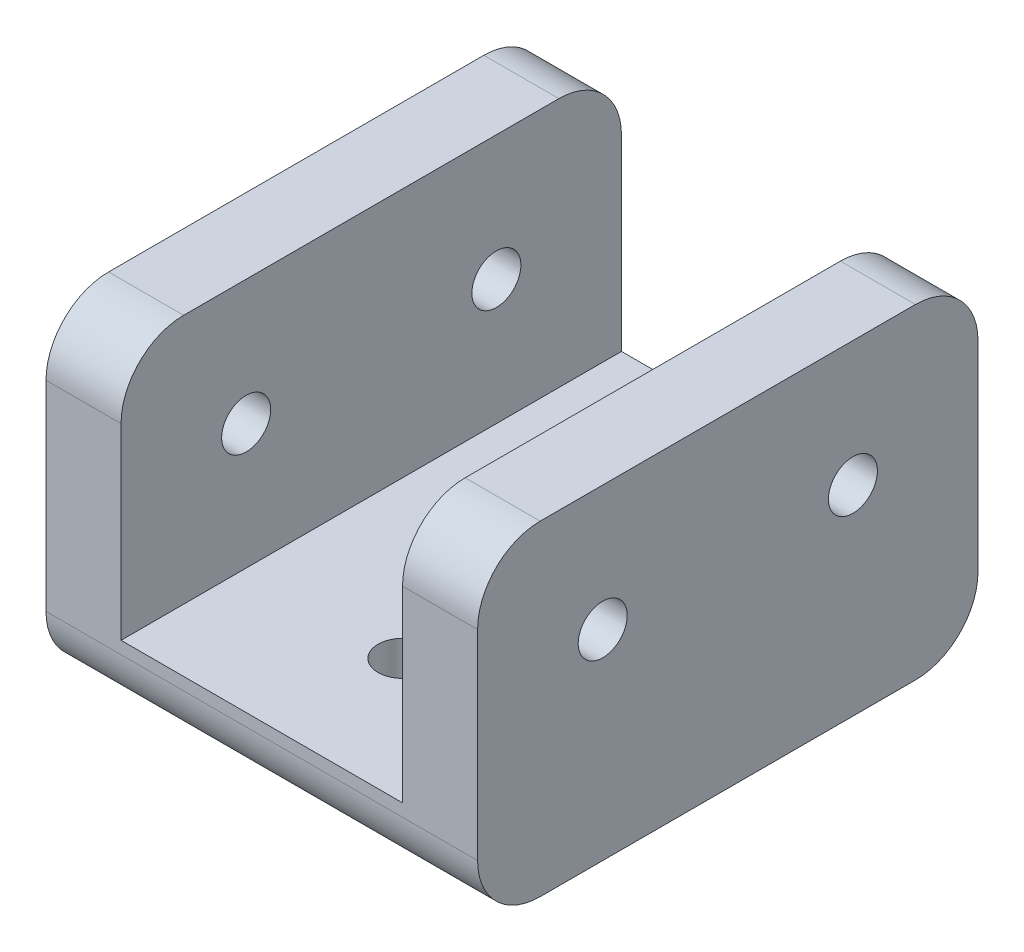
ISO-10303-21;
HEADER;
FILE_DESCRIPTION(('STEP AP214'),'2;1');
FILE_NAME('part.step','',(''),(''),'','','');
FILE_SCHEMA(('AUTOMOTIVE_DESIGN { 1 0 10303 214 1 1 1 1 }'));
ENDSEC;
DATA;
#1=APPLICATION_CONTEXT('core data for automotive mechanical design processes');
#2=APPLICATION_PROTOCOL_DEFINITION('international standard','automotive_design',2000,#1);
#3=PRODUCT_CONTEXT('',#1,'mechanical');
#4=PRODUCT('Part','Part','',(#3));
#5=PRODUCT_RELATED_PRODUCT_CATEGORY('part','',(#4));
#6=PRODUCT_DEFINITION_FORMATION('','',#4);
#7=PRODUCT_DEFINITION_CONTEXT('part definition',#1,'design');
#8=PRODUCT_DEFINITION('design','',#6,#7);
#9=PRODUCT_DEFINITION_SHAPE('','',#8);
#10=(LENGTH_UNIT() NAMED_UNIT(*) SI_UNIT(.MILLI.,.METRE.));
#11=(NAMED_UNIT(*) PLANE_ANGLE_UNIT() SI_UNIT($,.RADIAN.));
#12=(NAMED_UNIT(*) SI_UNIT($,.STERADIAN.) SOLID_ANGLE_UNIT());
#13=UNCERTAINTY_MEASURE_WITH_UNIT(LENGTH_MEASURE(1.E-05),#10,'distance_accuracy_value','');
#14=(GEOMETRIC_REPRESENTATION_CONTEXT(3) GLOBAL_UNCERTAINTY_ASSIGNED_CONTEXT((#13)) GLOBAL_UNIT_ASSIGNED_CONTEXT((#10,
#11,#12)) REPRESENTATION_CONTEXT('',''));
#15=CARTESIAN_POINT('',(0.,0.,0.));
#16=DIRECTION('',(0.,0.,1.));
#17=DIRECTION('',(1.,0.,0.));
#18=AXIS2_PLACEMENT_3D('',#15,#16,#17);
#19=CARTESIAN_POINT('',(0.,33.02,-50.8));
#20=DIRECTION('',(0.,-1.,0.));
#21=DIRECTION('',(0.,0.,-1.));
#22=AXIS2_PLACEMENT_3D('',#19,#20,#21);
#23=PLANE('',#22);
#24=DIRECTION('',(0.,0.,1.));
#25=VECTOR('',#24,1.);
#26=CARTESIAN_POINT('',(43.815,33.02,-50.8));
#27=LINE('',#26,#25);
#28=CARTESIAN_POINT('',(43.815,33.02,-44.45));
#29=VERTEX_POINT('',#28);
#30=CARTESIAN_POINT('',(43.815,33.02,-6.35));
#31=VERTEX_POINT('',#30);
#32=EDGE_CURVE('E183',#29,#31,#27,.T.);
#33=ORIENTED_EDGE('',*,*,#32,.F.);
#34=DIRECTION('',(1.,0.,0.));
#35=VECTOR('',#34,1.);
#36=CARTESIAN_POINT('',(0.,33.02,-44.45));
#37=LINE('',#36,#35);
#38=CARTESIAN_POINT('',(36.195,33.02,-44.45));
#39=VERTEX_POINT('',#38);
#40=EDGE_CURVE('E198',#29,#39,#37,.F.);
#41=ORIENTED_EDGE('',*,*,#40,.T.);
#42=DIRECTION('',(0.,0.,1.));
#43=VECTOR('',#42,1.);
#44=CARTESIAN_POINT('',(36.195,33.02,-50.8));
#45=LINE('',#44,#43);
#46=CARTESIAN_POINT('',(36.195,33.02,-6.35));
#47=VERTEX_POINT('',#46);
#48=EDGE_CURVE('E171',#39,#47,#45,.T.);
#49=ORIENTED_EDGE('',*,*,#48,.T.);
#50=DIRECTION('',(1.,0.,0.));
#51=VECTOR('',#50,1.);
#52=CARTESIAN_POINT('',(43.815,33.02,-6.35));
#53=LINE('',#52,#51);
#54=EDGE_CURVE('E195',#47,#31,#53,.T.);
#55=ORIENTED_EDGE('',*,*,#54,.T.);
#56=EDGE_LOOP('',(#33,#41,#49,#55));
#57=FACE_BOUND('',#56,.T.);
#58=ADVANCED_FACE('F41',(#57),#23,.F.);
#59=CARTESIAN_POINT('',(43.815,0.,-50.8));
#60=DIRECTION('',(1.,0.,0.));
#61=DIRECTION('',(0.,0.,-1.));
#62=AXIS2_PLACEMENT_3D('',#59,#60,#61);
#63=PLANE('',#62);
#64=CARTESIAN_POINT('',(43.815,20.32,-38.1));
#65=DIRECTION('',(-1.,0.,0.));
#66=DIRECTION('',(0.,0.,1.));
#67=AXIS2_PLACEMENT_3D('',#64,#65,#66);
#68=CIRCLE('',#67,2.4892);
#69=CARTESIAN_POINT('',(43.815,20.32,-35.6108));
#70=VERTEX_POINT('',#69);
#71=EDGE_CURVE('E232',#70,#70,#68,.T.);
#72=ORIENTED_EDGE('',*,*,#71,.T.);
#73=EDGE_LOOP('',(#72));
#74=FACE_BOUND('',#73,.T.);
#75=CARTESIAN_POINT('',(43.815,20.32,-12.7));
#76=DIRECTION('',(-1.,0.,0.));
#77=DIRECTION('',(0.,0.,1.));
#78=AXIS2_PLACEMENT_3D('',#75,#76,#77);
#79=CIRCLE('',#78,2.4892);
#80=CARTESIAN_POINT('',(43.815,20.32,-10.2108));
#81=VERTEX_POINT('',#80);
#82=EDGE_CURVE('E242',#81,#81,#79,.T.);
#83=ORIENTED_EDGE('',*,*,#82,.T.);
#84=EDGE_LOOP('',(#83));
#85=FACE_BOUND('',#84,.T.);
#86=DIRECTION('',(0.,1.,0.));
#87=VECTOR('',#86,1.);
#88=CARTESIAN_POINT('',(43.815,0.,-50.8));
#89=LINE('',#88,#87);
#90=CARTESIAN_POINT('',(43.815,6.35,-50.8));
#91=VERTEX_POINT('',#90);
#92=CARTESIAN_POINT('',(43.815,26.67,-50.8));
#93=VERTEX_POINT('',#92);
#94=EDGE_CURVE('E176',#91,#93,#89,.T.);
#95=ORIENTED_EDGE('',*,*,#94,.T.);
#96=CARTESIAN_POINT('',(43.815,26.67,-44.45));
#97=DIRECTION('',(1.,0.,0.));
#98=DIRECTION('',(0.,0.,-1.));
#99=AXIS2_PLACEMENT_3D('',#96,#97,#98);
#100=CIRCLE('',#99,6.35);
#101=EDGE_CURVE('E193',#93,#29,#100,.T.);
#102=ORIENTED_EDGE('',*,*,#101,.T.);
#103=ORIENTED_EDGE('',*,*,#32,.T.);
#104=CARTESIAN_POINT('',(43.815,26.67,-6.35));
#105=DIRECTION('',(1.,0.,0.));
#106=DIRECTION('',(0.,0.,-1.));
#107=AXIS2_PLACEMENT_3D('',#104,#105,#106);
#108=CIRCLE('',#107,6.35);
#109=CARTESIAN_POINT('',(43.815,26.67,0.));
#110=VERTEX_POINT('',#109);
#111=EDGE_CURVE('E191',#31,#110,#108,.T.);
#112=ORIENTED_EDGE('',*,*,#111,.T.);
#113=DIRECTION('',(0.,1.,0.));
#114=VECTOR('',#113,1.);
#115=CARTESIAN_POINT('',(43.815,0.,0.));
#116=LINE('',#115,#114);
#117=CARTESIAN_POINT('',(43.815,6.35,0.));
#118=VERTEX_POINT('',#117);
#119=EDGE_CURVE('E157',#118,#110,#116,.T.);
#120=ORIENTED_EDGE('',*,*,#119,.F.);
#121=CARTESIAN_POINT('',(43.815,6.35,-6.35));
#122=DIRECTION('',(1.,0.,0.));
#123=DIRECTION('',(0.,0.,-1.));
#124=AXIS2_PLACEMENT_3D('',#121,#122,#123);
#125=CIRCLE('',#124,6.35);
#126=CARTESIAN_POINT('',(43.815,0.,-6.35));
#127=VERTEX_POINT('',#126);
#128=EDGE_CURVE('E189',#118,#127,#125,.T.);
#129=ORIENTED_EDGE('',*,*,#128,.T.);
#130=DIRECTION('',(0.,0.,1.));
#131=VECTOR('',#130,1.);
#132=CARTESIAN_POINT('',(43.815,0.,-50.8));
#133=LINE('',#132,#131);
#134=CARTESIAN_POINT('',(43.815,0.,-44.45));
#135=VERTEX_POINT('',#134);
#136=EDGE_CURVE('E283',#135,#127,#133,.T.);
#137=ORIENTED_EDGE('',*,*,#136,.F.);
#138=CARTESIAN_POINT('',(43.815,6.35,-44.45));
#139=DIRECTION('',(1.,0.,0.));
#140=DIRECTION('',(0.,0.,-1.));
#141=AXIS2_PLACEMENT_3D('',#138,#139,#140);
#142=CIRCLE('',#141,6.35);
#143=EDGE_CURVE('E187',#135,#91,#142,.T.);
#144=ORIENTED_EDGE('',*,*,#143,.T.);
#145=EDGE_LOOP('',(#95,#102,#103,#112,#120,#129,#137,#144));
#146=FACE_BOUND('',#145,.T.);
#147=ADVANCED_FACE('F332',(#74,#85,#146),#63,.T.);
#148=CARTESIAN_POINT('',(0.,0.,-50.8));
#149=DIRECTION('',(0.,-1.,0.));
#150=DIRECTION('',(0.,0.,-1.));
#151=AXIS2_PLACEMENT_3D('',#148,#149,#150);
#152=PLANE('',#151);
#153=CARTESIAN_POINT('',(23.495,0.,-38.1));
#154=DIRECTION('',(0.,-1.,0.));
#155=DIRECTION('',(0.,0.,-1.));
#156=AXIS2_PLACEMENT_3D('',#153,#154,#155);
#157=CIRCLE('',#156,2.4892);
#158=CARTESIAN_POINT('',(23.495,0.,-40.5892));
#159=VERTEX_POINT('',#158);
#160=EDGE_CURVE('E238',#159,#159,#157,.T.);
#161=ORIENTED_EDGE('',*,*,#160,.F.);
#162=EDGE_LOOP('',(#161));
#163=FACE_BOUND('',#162,.T.);
#164=CARTESIAN_POINT('',(23.495,0.,-12.7));
#165=DIRECTION('',(0.,-1.,0.));
#166=DIRECTION('',(0.,0.,-1.));
#167=AXIS2_PLACEMENT_3D('',#164,#165,#166);
#168=CIRCLE('',#167,2.4892);
#169=CARTESIAN_POINT('',(23.495,0.,-15.1892));
#170=VERTEX_POINT('',#169);
#171=EDGE_CURVE('E244',#170,#170,#168,.T.);
#172=ORIENTED_EDGE('',*,*,#171,.F.);
#173=EDGE_LOOP('',(#172));
#174=FACE_BOUND('',#173,.T.);
#175=ORIENTED_EDGE('',*,*,#136,.T.);
#176=DIRECTION('',(1.,0.,0.));
#177=VECTOR('',#176,1.);
#178=CARTESIAN_POINT('',(0.,0.,-6.35));
#179=LINE('',#178,#177);
#180=CARTESIAN_POINT('',(0.,0.,-6.35));
#181=VERTEX_POINT('',#180);
#182=EDGE_CURVE('E213',#127,#181,#179,.F.);
#183=ORIENTED_EDGE('',*,*,#182,.T.);
#184=DIRECTION('',(0.,0.,1.));
#185=VECTOR('',#184,1.);
#186=CARTESIAN_POINT('',(0.,0.,-50.8));
#187=LINE('',#186,#185);
#188=CARTESIAN_POINT('',(0.,0.,-44.45));
#189=VERTEX_POINT('',#188);
#190=EDGE_CURVE('E286',#189,#181,#187,.T.);
#191=ORIENTED_EDGE('',*,*,#190,.F.);
#192=DIRECTION('',(1.,0.,0.));
#193=VECTOR('',#192,1.);
#194=CARTESIAN_POINT('',(43.815,0.,-44.45));
#195=LINE('',#194,#193);
#196=EDGE_CURVE('E210',#189,#135,#195,.T.);
#197=ORIENTED_EDGE('',*,*,#196,.T.);
#198=EDGE_LOOP('',(#175,#183,#191,#197));
#199=FACE_BOUND('',#198,.T.);
#200=ADVANCED_FACE('F312',(#163,#174,#199),#152,.T.);
#201=CARTESIAN_POINT('',(0.,0.,-50.8));
#202=DIRECTION('',(1.,0.,0.));
#203=DIRECTION('',(0.,0.,-1.));
#204=AXIS2_PLACEMENT_3D('',#201,#202,#203);
#205=PLANE('',#204);
#206=CARTESIAN_POINT('',(0.,20.32,-38.1));
#207=DIRECTION('',(-1.,0.,0.));
#208=DIRECTION('',(0.,0.,1.));
#209=AXIS2_PLACEMENT_3D('',#206,#207,#208);
#210=CIRCLE('',#209,2.4892);
#211=CARTESIAN_POINT('',(0.,20.32,-35.6108));
#212=VERTEX_POINT('',#211);
#213=EDGE_CURVE('E253',#212,#212,#210,.T.);
#214=ORIENTED_EDGE('',*,*,#213,.F.);
#215=EDGE_LOOP('',(#214));
#216=FACE_BOUND('',#215,.T.);
#217=CARTESIAN_POINT('',(0.,20.32,-12.7));
#218=DIRECTION('',(-1.,0.,0.));
#219=DIRECTION('',(0.,0.,1.));
#220=AXIS2_PLACEMENT_3D('',#217,#218,#219);
#221=CIRCLE('',#220,2.4892);
#222=CARTESIAN_POINT('',(0.,20.32,-10.2108));
#223=VERTEX_POINT('',#222);
#224=EDGE_CURVE('E256',#223,#223,#221,.T.);
#225=ORIENTED_EDGE('',*,*,#224,.F.);
#226=EDGE_LOOP('',(#225));
#227=FACE_BOUND('',#226,.T.);
#228=ORIENTED_EDGE('',*,*,#190,.T.);
#229=CARTESIAN_POINT('',(0.,6.35,-6.35));
#230=DIRECTION('',(1.,0.,0.));
#231=DIRECTION('',(0.,0.,-1.));
#232=AXIS2_PLACEMENT_3D('',#229,#230,#231);
#233=CIRCLE('',#232,6.35);
#234=CARTESIAN_POINT('',(0.,6.35,0.));
#235=VERTEX_POINT('',#234);
#236=EDGE_CURVE('E221',#181,#235,#233,.F.);
#237=ORIENTED_EDGE('',*,*,#236,.T.);
#238=DIRECTION('',(0.,1.,0.));
#239=VECTOR('',#238,1.);
#240=CARTESIAN_POINT('',(0.,0.,0.));
#241=LINE('',#240,#239);
#242=CARTESIAN_POINT('',(0.,26.67,0.));
#243=VERTEX_POINT('',#242);
#244=EDGE_CURVE('E276',#235,#243,#241,.T.);
#245=ORIENTED_EDGE('',*,*,#244,.T.);
#246=CARTESIAN_POINT('',(0.,26.67,-6.35));
#247=DIRECTION('',(1.,0.,0.));
#248=DIRECTION('',(0.,0.,-1.));
#249=AXIS2_PLACEMENT_3D('',#246,#247,#248);
#250=CIRCLE('',#249,6.35);
#251=CARTESIAN_POINT('',(0.,33.02,-6.35));
#252=VERTEX_POINT('',#251);
#253=EDGE_CURVE('E217',#243,#252,#250,.F.);
#254=ORIENTED_EDGE('',*,*,#253,.T.);
#255=DIRECTION('',(0.,0.,1.));
#256=VECTOR('',#255,1.);
#257=CARTESIAN_POINT('',(0.,33.02,-50.8));
#258=LINE('',#257,#256);
#259=CARTESIAN_POINT('',(0.,33.02,-44.45));
#260=VERTEX_POINT('',#259);
#261=EDGE_CURVE('E289',#260,#252,#258,.T.);
#262=ORIENTED_EDGE('',*,*,#261,.F.);
#263=CARTESIAN_POINT('',(0.,26.67,-44.45));
#264=DIRECTION('',(1.,0.,0.));
#265=DIRECTION('',(0.,0.,-1.));
#266=AXIS2_PLACEMENT_3D('',#263,#264,#265);
#267=CIRCLE('',#266,6.35);
#268=CARTESIAN_POINT('',(0.,26.67,-50.8));
#269=VERTEX_POINT('',#268);
#270=EDGE_CURVE('E215',#260,#269,#267,.F.);
#271=ORIENTED_EDGE('',*,*,#270,.T.);
#272=DIRECTION('',(0.,1.,0.));
#273=VECTOR('',#272,1.);
#274=CARTESIAN_POINT('',(0.,0.,-50.8));
#275=LINE('',#274,#273);
#276=CARTESIAN_POINT('',(0.,6.35,-50.8));
#277=VERTEX_POINT('',#276);
#278=EDGE_CURVE('E267',#277,#269,#275,.T.);
#279=ORIENTED_EDGE('',*,*,#278,.F.);
#280=CARTESIAN_POINT('',(0.,6.35,-44.45));
#281=DIRECTION('',(1.,0.,0.));
#282=DIRECTION('',(0.,0.,-1.));
#283=AXIS2_PLACEMENT_3D('',#280,#281,#282);
#284=CIRCLE('',#283,6.35);
#285=EDGE_CURVE('E219',#277,#189,#284,.F.);
#286=ORIENTED_EDGE('',*,*,#285,.T.);
#287=EDGE_LOOP('',(#228,#237,#245,#254,#262,#271,#279,#286));
#288=FACE_BOUND('',#287,.T.);
#289=ADVANCED_FACE('F302',(#216,#227,#288),#205,.F.);
#290=ORIENTED_EDGE('',*,*,#261,.T.);
#291=DIRECTION('',(1.,0.,0.));
#292=VECTOR('',#291,1.);
#293=CARTESIAN_POINT('',(7.62,33.02,-6.35));
#294=LINE('',#293,#292);
#295=CARTESIAN_POINT('',(7.62,33.02,-6.35));
#296=VERTEX_POINT('',#295);
#297=EDGE_CURVE('E225',#252,#296,#294,.T.);
#298=ORIENTED_EDGE('',*,*,#297,.T.);
#299=DIRECTION('',(0.,0.,1.));
#300=VECTOR('',#299,1.);
#301=CARTESIAN_POINT('',(7.62,33.02,-50.8));
#302=LINE('',#301,#300);
#303=CARTESIAN_POINT('',(7.62,33.02,-44.45));
#304=VERTEX_POINT('',#303);
#305=EDGE_CURVE('E173',#304,#296,#302,.T.);
#306=ORIENTED_EDGE('',*,*,#305,.F.);
#307=DIRECTION('',(1.,0.,0.));
#308=VECTOR('',#307,1.);
#309=CARTESIAN_POINT('',(0.,33.02,-44.45));
#310=LINE('',#309,#308);
#311=EDGE_CURVE('E223',#304,#260,#310,.F.);
#312=ORIENTED_EDGE('',*,*,#311,.T.);
#313=EDGE_LOOP('',(#290,#298,#306,#312));
#314=FACE_BOUND('',#313,.T.);
#315=ADVANCED_FACE('F295',(#314),#23,.F.);
#316=CARTESIAN_POINT('',(7.62,0.,-50.8));
#317=DIRECTION('',(-1.,0.,0.));
#318=DIRECTION('',(0.,-1.,0.));
#319=AXIS2_PLACEMENT_3D('',#316,#317,#318);
#320=PLANE('',#319);
#321=CARTESIAN_POINT('',(7.62,20.32,-38.1));
#322=DIRECTION('',(-1.,0.,0.));
#323=DIRECTION('',(0.,-1.,0.));
#324=AXIS2_PLACEMENT_3D('',#321,#322,#323);
#325=CIRCLE('',#324,2.4892);
#326=CARTESIAN_POINT('',(7.62,17.8308,-38.1));
#327=VERTEX_POINT('',#326);
#328=EDGE_CURVE('E235',#327,#327,#325,.T.);
#329=ORIENTED_EDGE('',*,*,#328,.T.);
#330=EDGE_LOOP('',(#329));
#331=FACE_BOUND('',#330,.T.);
#332=CARTESIAN_POINT('',(7.62,20.32,-12.7));
#333=DIRECTION('',(-1.,0.,0.));
#334=DIRECTION('',(0.,-1.,0.));
#335=AXIS2_PLACEMENT_3D('',#332,#333,#334);
#336=CIRCLE('',#335,2.4892);
#337=CARTESIAN_POINT('',(7.62,17.8308,-12.7));
#338=VERTEX_POINT('',#337);
#339=EDGE_CURVE('E231',#338,#338,#336,.T.);
#340=ORIENTED_EDGE('',*,*,#339,.T.);
#341=EDGE_LOOP('',(#340));
#342=FACE_BOUND('',#341,.T.);
#343=ORIENTED_EDGE('',*,*,#305,.T.);
#344=CARTESIAN_POINT('',(7.62,26.67,-6.35));
#345=DIRECTION('',(-1.,0.,0.));
#346=DIRECTION('',(0.,-1.,0.));
#347=AXIS2_PLACEMENT_3D('',#344,#345,#346);
#348=CIRCLE('',#347,6.35);
#349=CARTESIAN_POINT('',(7.62,26.67,0.));
#350=VERTEX_POINT('',#349);
#351=EDGE_CURVE('E11',#296,#350,#348,.F.);
#352=ORIENTED_EDGE('',*,*,#351,.T.);
#353=DIRECTION('',(0.,-1.,0.));
#354=VECTOR('',#353,1.);
#355=CARTESIAN_POINT('',(7.62,0.,0.));
#356=LINE('',#355,#354);
#357=CARTESIAN_POINT('',(7.62,7.62,0.));
#358=VERTEX_POINT('',#357);
#359=EDGE_CURVE('E274',#350,#358,#356,.T.);
#360=ORIENTED_EDGE('',*,*,#359,.T.);
#361=DIRECTION('',(0.,0.,1.));
#362=VECTOR('',#361,1.);
#363=CARTESIAN_POINT('',(7.62,7.62,-50.8));
#364=LINE('',#363,#362);
#365=CARTESIAN_POINT('',(7.62,7.62,-50.8));
#366=VERTEX_POINT('',#365);
#367=EDGE_CURVE('E170',#366,#358,#364,.T.);
#368=ORIENTED_EDGE('',*,*,#367,.F.);
#369=DIRECTION('',(0.,-1.,0.));
#370=VECTOR('',#369,1.);
#371=CARTESIAN_POINT('',(7.62,0.,-50.8));
#372=LINE('',#371,#370);
#373=CARTESIAN_POINT('',(7.62,26.67,-50.8));
#374=VERTEX_POINT('',#373);
#375=EDGE_CURVE('E162',#374,#366,#372,.T.);
#376=ORIENTED_EDGE('',*,*,#375,.F.);
#377=CARTESIAN_POINT('',(7.62,26.67,-44.45));
#378=DIRECTION('',(-1.,0.,0.));
#379=DIRECTION('',(0.,-1.,0.));
#380=AXIS2_PLACEMENT_3D('',#377,#378,#379);
#381=CIRCLE('',#380,6.35);
#382=EDGE_CURVE('E50',#374,#304,#381,.F.);
#383=ORIENTED_EDGE('',*,*,#382,.T.);
#384=EDGE_LOOP('',(#343,#352,#360,#368,#376,#383));
#385=FACE_BOUND('',#384,.T.);
#386=ADVANCED_FACE('F291',(#331,#342,#385),#320,.F.);
#387=CARTESIAN_POINT('',(0.,7.62,-50.8));
#388=DIRECTION('',(0.,-1.,0.));
#389=DIRECTION('',(0.,0.,-1.));
#390=AXIS2_PLACEMENT_3D('',#387,#388,#389);
#391=PLANE('',#390);
#392=CARTESIAN_POINT('',(23.495,7.62,-38.1));
#393=DIRECTION('',(0.,-1.,0.));
#394=DIRECTION('',(0.,0.,-1.));
#395=AXIS2_PLACEMENT_3D('',#392,#393,#394);
#396=CIRCLE('',#395,2.4892);
#397=CARTESIAN_POINT('',(23.495,7.62,-40.5892));
#398=VERTEX_POINT('',#397);
#399=EDGE_CURVE('E45',#398,#398,#396,.T.);
#400=ORIENTED_EDGE('',*,*,#399,.T.);
#401=EDGE_LOOP('',(#400));
#402=FACE_BOUND('',#401,.T.);
#403=CARTESIAN_POINT('',(23.495,7.62,-12.7));
#404=DIRECTION('',(0.,-1.,0.));
#405=DIRECTION('',(0.,0.,-1.));
#406=AXIS2_PLACEMENT_3D('',#403,#404,#405);
#407=CIRCLE('',#406,2.4892);
#408=CARTESIAN_POINT('',(23.495,7.62,-15.1892));
#409=VERTEX_POINT('',#408);
#410=EDGE_CURVE('E236',#409,#409,#407,.T.);
#411=ORIENTED_EDGE('',*,*,#410,.T.);
#412=EDGE_LOOP('',(#411));
#413=FACE_BOUND('',#412,.T.);
#414=DIRECTION('',(1.,0.,0.));
#415=VECTOR('',#414,1.);
#416=CARTESIAN_POINT('',(0.,7.62,0.));
#417=LINE('',#416,#415);
#418=CARTESIAN_POINT('',(36.195,7.62,0.));
#419=VERTEX_POINT('',#418);
#420=EDGE_CURVE('E169',#358,#419,#417,.T.);
#421=ORIENTED_EDGE('',*,*,#420,.T.);
#422=DIRECTION('',(0.,0.,1.));
#423=VECTOR('',#422,1.);
#424=CARTESIAN_POINT('',(36.195,7.62,-50.8));
#425=LINE('',#424,#423);
#426=CARTESIAN_POINT('',(36.195,7.62,-50.8));
#427=VERTEX_POINT('',#426);
#428=EDGE_CURVE('E149',#427,#419,#425,.T.);
#429=ORIENTED_EDGE('',*,*,#428,.F.);
#430=DIRECTION('',(1.,0.,0.));
#431=VECTOR('',#430,1.);
#432=CARTESIAN_POINT('',(0.,7.62,-50.8));
#433=LINE('',#432,#431);
#434=EDGE_CURVE('E156',#366,#427,#433,.T.);
#435=ORIENTED_EDGE('',*,*,#434,.F.);
#436=ORIENTED_EDGE('',*,*,#367,.T.);
#437=EDGE_LOOP('',(#421,#429,#435,#436));
#438=FACE_BOUND('',#437,.T.);
#439=ADVANCED_FACE('F167',(#402,#413,#438),#391,.F.);
#440=CARTESIAN_POINT('',(36.195,0.,-50.8));
#441=DIRECTION('',(-1.,0.,0.));
#442=DIRECTION('',(0.,-1.,0.));
#443=AXIS2_PLACEMENT_3D('',#440,#441,#442);
#444=PLANE('',#443);
#445=CARTESIAN_POINT('',(36.195,20.32,-38.1));
#446=DIRECTION('',(-1.,0.,0.));
#447=DIRECTION('',(0.,-1.,0.));
#448=AXIS2_PLACEMENT_3D('',#445,#446,#447);
#449=CIRCLE('',#448,2.4892);
#450=CARTESIAN_POINT('',(36.195,17.8308,-38.1));
#451=VERTEX_POINT('',#450);
#452=EDGE_CURVE('E233',#451,#451,#449,.T.);
#453=ORIENTED_EDGE('',*,*,#452,.F.);
#454=EDGE_LOOP('',(#453));
#455=FACE_BOUND('',#454,.T.);
#456=CARTESIAN_POINT('',(36.195,20.32,-12.7));
#457=DIRECTION('',(-1.,0.,0.));
#458=DIRECTION('',(0.,-1.,0.));
#459=AXIS2_PLACEMENT_3D('',#456,#457,#458);
#460=CIRCLE('',#459,2.4892);
#461=CARTESIAN_POINT('',(36.195,17.8308,-12.7));
#462=VERTEX_POINT('',#461);
#463=EDGE_CURVE('E228',#462,#462,#460,.T.);
#464=ORIENTED_EDGE('',*,*,#463,.F.);
#465=EDGE_LOOP('',(#464));
#466=FACE_BOUND('',#465,.T.);
#467=ORIENTED_EDGE('',*,*,#48,.F.);
#468=CARTESIAN_POINT('',(36.195,26.67,-44.45));
#469=DIRECTION('',(-1.,0.,0.));
#470=DIRECTION('',(0.,-1.,0.));
#471=AXIS2_PLACEMENT_3D('',#468,#469,#470);
#472=CIRCLE('',#471,6.35);
#473=CARTESIAN_POINT('',(36.195,26.67,-50.8));
#474=VERTEX_POINT('',#473);
#475=EDGE_CURVE('E152',#39,#474,#472,.T.);
#476=ORIENTED_EDGE('',*,*,#475,.T.);
#477=DIRECTION('',(0.,-1.,0.));
#478=VECTOR('',#477,1.);
#479=CARTESIAN_POINT('',(36.195,0.,-50.8));
#480=LINE('',#479,#478);
#481=EDGE_CURVE('E143',#474,#427,#480,.T.);
#482=ORIENTED_EDGE('',*,*,#481,.T.);
#483=ORIENTED_EDGE('',*,*,#428,.T.);
#484=DIRECTION('',(0.,-1.,0.));
#485=VECTOR('',#484,1.);
#486=CARTESIAN_POINT('',(36.195,0.,0.));
#487=LINE('',#486,#485);
#488=CARTESIAN_POINT('',(36.195,26.67,0.));
#489=VERTEX_POINT('',#488);
#490=EDGE_CURVE('E264',#489,#419,#487,.T.);
#491=ORIENTED_EDGE('',*,*,#490,.F.);
#492=CARTESIAN_POINT('',(36.195,26.67,-6.35));
#493=DIRECTION('',(-1.,0.,0.));
#494=DIRECTION('',(0.,-1.,0.));
#495=AXIS2_PLACEMENT_3D('',#492,#493,#494);
#496=CIRCLE('',#495,6.35);
#497=EDGE_CURVE('E200',#489,#47,#496,.T.);
#498=ORIENTED_EDGE('',*,*,#497,.T.);
#499=EDGE_LOOP('',(#467,#476,#482,#483,#491,#498));
#500=FACE_BOUND('',#499,.T.);
#501=ADVANCED_FACE('F146',(#455,#466,#500),#444,.T.);
#502=CARTESIAN_POINT('',(0.,0.,-50.8));
#503=DIRECTION('',(0.,0.,1.));
#504=DIRECTION('',(1.,0.,0.));
#505=AXIS2_PLACEMENT_3D('',#502,#503,#504);
#506=PLANE('',#505);
#507=ORIENTED_EDGE('',*,*,#481,.F.);
#508=DIRECTION('',(1.,0.,0.));
#509=VECTOR('',#508,1.);
#510=CARTESIAN_POINT('',(0.,26.67,-50.8));
#511=LINE('',#510,#509);
#512=EDGE_CURVE('E185',#474,#93,#511,.T.);
#513=ORIENTED_EDGE('',*,*,#512,.T.);
#514=ORIENTED_EDGE('',*,*,#94,.F.);
#515=DIRECTION('',(1.,0.,0.));
#516=VECTOR('',#515,1.);
#517=CARTESIAN_POINT('',(0.,6.35,-50.8));
#518=LINE('',#517,#516);
#519=EDGE_CURVE('E182',#91,#277,#518,.F.);
#520=ORIENTED_EDGE('',*,*,#519,.T.);
#521=ORIENTED_EDGE('',*,*,#278,.T.);
#522=DIRECTION('',(1.,0.,0.));
#523=VECTOR('',#522,1.);
#524=CARTESIAN_POINT('',(0.,26.67,-50.8));
#525=LINE('',#524,#523);
#526=EDGE_CURVE('E180',#269,#374,#525,.T.);
#527=ORIENTED_EDGE('',*,*,#526,.T.);
#528=ORIENTED_EDGE('',*,*,#375,.T.);
#529=ORIENTED_EDGE('',*,*,#434,.T.);
#530=EDGE_LOOP('',(#507,#513,#514,#520,#521,#527,#528,#529));
#531=FACE_BOUND('',#530,.T.);
#532=ADVANCED_FACE('F160',(#531),#506,.F.);
#533=CARTESIAN_POINT('',(0.,0.,0.));
#534=DIRECTION('',(0.,0.,1.));
#535=DIRECTION('',(1.,0.,0.));
#536=AXIS2_PLACEMENT_3D('',#533,#534,#535);
#537=PLANE('',#536);
#538=ORIENTED_EDGE('',*,*,#119,.T.);
#539=DIRECTION('',(1.,0.,0.));
#540=VECTOR('',#539,1.);
#541=CARTESIAN_POINT('',(36.195,26.67,0.));
#542=LINE('',#541,#540);
#543=EDGE_CURVE('E208',#110,#489,#542,.F.);
#544=ORIENTED_EDGE('',*,*,#543,.T.);
#545=ORIENTED_EDGE('',*,*,#490,.T.);
#546=ORIENTED_EDGE('',*,*,#420,.F.);
#547=ORIENTED_EDGE('',*,*,#359,.F.);
#548=DIRECTION('',(1.,0.,0.));
#549=VECTOR('',#548,1.);
#550=CARTESIAN_POINT('',(0.,26.67,0.));
#551=LINE('',#550,#549);
#552=EDGE_CURVE('E203',#350,#243,#551,.F.);
#553=ORIENTED_EDGE('',*,*,#552,.T.);
#554=ORIENTED_EDGE('',*,*,#244,.F.);
#555=DIRECTION('',(1.,0.,0.));
#556=VECTOR('',#555,1.);
#557=CARTESIAN_POINT('',(0.,6.35,0.));
#558=LINE('',#557,#556);
#559=EDGE_CURVE('E205',#235,#118,#558,.T.);
#560=ORIENTED_EDGE('',*,*,#559,.T.);
#561=EDGE_LOOP('',(#538,#544,#545,#546,#547,#553,#554,#560));
#562=FACE_BOUND('',#561,.T.);
#563=ADVANCED_FACE('F321',(#562),#537,.T.);
#564=CARTESIAN_POINT('',(0.,26.67,-44.45));
#565=DIRECTION('',(1.,0.,0.));
#566=DIRECTION('',(0.,0.,-1.));
#567=AXIS2_PLACEMENT_3D('',#564,#565,#566);
#568=CYLINDRICAL_SURFACE('',#567,6.35);
#569=ORIENTED_EDGE('',*,*,#475,.F.);
#570=ORIENTED_EDGE('',*,*,#40,.F.);
#571=ORIENTED_EDGE('',*,*,#101,.F.);
#572=ORIENTED_EDGE('',*,*,#512,.F.);
#573=EDGE_LOOP('',(#569,#570,#571,#572));
#574=FACE_BOUND('',#573,.T.);
#575=ADVANCED_FACE('F361',(#574),#568,.T.);
#576=CARTESIAN_POINT('',(0.,26.67,-6.35));
#577=DIRECTION('',(-1.,0.,0.));
#578=DIRECTION('',(0.,0.,1.));
#579=AXIS2_PLACEMENT_3D('',#576,#577,#578);
#580=CYLINDRICAL_SURFACE('',#579,6.35);
#581=ORIENTED_EDGE('',*,*,#497,.F.);
#582=ORIENTED_EDGE('',*,*,#543,.F.);
#583=ORIENTED_EDGE('',*,*,#111,.F.);
#584=ORIENTED_EDGE('',*,*,#54,.F.);
#585=EDGE_LOOP('',(#581,#582,#583,#584));
#586=FACE_BOUND('',#585,.T.);
#587=ADVANCED_FACE('F393',(#586),#580,.T.);
#588=CARTESIAN_POINT('',(0.,6.35,-6.35));
#589=DIRECTION('',(1.,0.,0.));
#590=DIRECTION('',(0.,0.,-1.));
#591=AXIS2_PLACEMENT_3D('',#588,#589,#590);
#592=CYLINDRICAL_SURFACE('',#591,6.35);
#593=ORIENTED_EDGE('',*,*,#236,.F.);
#594=ORIENTED_EDGE('',*,*,#182,.F.);
#595=ORIENTED_EDGE('',*,*,#128,.F.);
#596=ORIENTED_EDGE('',*,*,#559,.F.);
#597=EDGE_LOOP('',(#593,#594,#595,#596));
#598=FACE_BOUND('',#597,.T.);
#599=ADVANCED_FACE('F316',(#598),#592,.T.);
#600=CARTESIAN_POINT('',(0.,6.35,-44.45));
#601=DIRECTION('',(-1.,0.,0.));
#602=DIRECTION('',(0.,0.,1.));
#603=AXIS2_PLACEMENT_3D('',#600,#601,#602);
#604=CYLINDRICAL_SURFACE('',#603,6.35);
#605=ORIENTED_EDGE('',*,*,#285,.F.);
#606=ORIENTED_EDGE('',*,*,#519,.F.);
#607=ORIENTED_EDGE('',*,*,#143,.F.);
#608=ORIENTED_EDGE('',*,*,#196,.F.);
#609=EDGE_LOOP('',(#605,#606,#607,#608));
#610=FACE_BOUND('',#609,.T.);
#611=ADVANCED_FACE('F307',(#610),#604,.T.);
#612=CARTESIAN_POINT('',(0.,26.67,-6.35));
#613=DIRECTION('',(-1.,0.,0.));
#614=DIRECTION('',(0.,0.,1.));
#615=AXIS2_PLACEMENT_3D('',#612,#613,#614);
#616=CYLINDRICAL_SURFACE('',#615,6.35);
#617=ORIENTED_EDGE('',*,*,#253,.F.);
#618=ORIENTED_EDGE('',*,*,#552,.F.);
#619=ORIENTED_EDGE('',*,*,#351,.F.);
#620=ORIENTED_EDGE('',*,*,#297,.F.);
#621=EDGE_LOOP('',(#617,#618,#619,#620));
#622=FACE_BOUND('',#621,.T.);
#623=ADVANCED_FACE('F323',(#622),#616,.T.);
#624=CARTESIAN_POINT('',(0.,26.67,-44.45));
#625=DIRECTION('',(1.,0.,0.));
#626=DIRECTION('',(0.,0.,-1.));
#627=AXIS2_PLACEMENT_3D('',#624,#625,#626);
#628=CYLINDRICAL_SURFACE('',#627,6.35);
#629=ORIENTED_EDGE('',*,*,#270,.F.);
#630=ORIENTED_EDGE('',*,*,#311,.F.);
#631=ORIENTED_EDGE('',*,*,#382,.F.);
#632=ORIENTED_EDGE('',*,*,#526,.F.);
#633=EDGE_LOOP('',(#629,#630,#631,#632));
#634=FACE_BOUND('',#633,.T.);
#635=ADVANCED_FACE('F43',(#634),#628,.T.);
#636=CARTESIAN_POINT('',(43.815,20.32,-12.7));
#637=DIRECTION('',(-1.,0.,0.));
#638=DIRECTION('',(0.,0.,1.));
#639=AXIS2_PLACEMENT_3D('',#636,#637,#638);
#640=CYLINDRICAL_SURFACE('',#639,2.4892);
#641=ORIENTED_EDGE('',*,*,#463,.T.);
#642=EDGE_LOOP('',(#641));
#643=FACE_BOUND('',#642,.T.);
#644=ORIENTED_EDGE('',*,*,#82,.F.);
#645=EDGE_LOOP('',(#644));
#646=FACE_BOUND('',#645,.T.);
#647=ADVANCED_FACE('F329',(#643,#646),#640,.F.);
#648=CARTESIAN_POINT('',(43.815,20.32,-38.1));
#649=DIRECTION('',(-1.,0.,0.));
#650=DIRECTION('',(0.,0.,1.));
#651=AXIS2_PLACEMENT_3D('',#648,#649,#650);
#652=CYLINDRICAL_SURFACE('',#651,2.4892);
#653=ORIENTED_EDGE('',*,*,#452,.T.);
#654=EDGE_LOOP('',(#653));
#655=FACE_BOUND('',#654,.T.);
#656=ORIENTED_EDGE('',*,*,#71,.F.);
#657=EDGE_LOOP('',(#656));
#658=FACE_BOUND('',#657,.T.);
#659=ADVANCED_FACE('F365',(#655,#658),#652,.F.);
#660=ORIENTED_EDGE('',*,*,#224,.T.);
#661=EDGE_LOOP('',(#660));
#662=FACE_BOUND('',#661,.T.);
#663=ORIENTED_EDGE('',*,*,#339,.F.);
#664=EDGE_LOOP('',(#663));
#665=FACE_BOUND('',#664,.T.);
#666=ADVANCED_FACE('F367',(#662,#665),#640,.F.);
#667=ORIENTED_EDGE('',*,*,#213,.T.);
#668=EDGE_LOOP('',(#667));
#669=FACE_BOUND('',#668,.T.);
#670=ORIENTED_EDGE('',*,*,#328,.F.);
#671=EDGE_LOOP('',(#670));
#672=FACE_BOUND('',#671,.T.);
#673=ADVANCED_FACE('F371',(#669,#672),#652,.F.);
#674=CARTESIAN_POINT('',(23.495,33.02,-12.7));
#675=DIRECTION('',(0.,-1.,0.));
#676=DIRECTION('',(0.,0.,-1.));
#677=AXIS2_PLACEMENT_3D('',#674,#675,#676);
#678=CYLINDRICAL_SURFACE('',#677,2.4892);
#679=ORIENTED_EDGE('',*,*,#171,.T.);
#680=EDGE_LOOP('',(#679));
#681=FACE_BOUND('',#680,.T.);
#682=ORIENTED_EDGE('',*,*,#410,.F.);
#683=EDGE_LOOP('',(#682));
#684=FACE_BOUND('',#683,.T.);
#685=ADVANCED_FACE('F372',(#681,#684),#678,.F.);
#686=CARTESIAN_POINT('',(23.495,33.02,-38.1));
#687=DIRECTION('',(0.,-1.,0.));
#688=DIRECTION('',(0.,0.,-1.));
#689=AXIS2_PLACEMENT_3D('',#686,#687,#688);
#690=CYLINDRICAL_SURFACE('',#689,2.4892);
#691=ORIENTED_EDGE('',*,*,#160,.T.);
#692=EDGE_LOOP('',(#691));
#693=FACE_BOUND('',#692,.T.);
#694=ORIENTED_EDGE('',*,*,#399,.F.);
#695=EDGE_LOOP('',(#694));
#696=FACE_BOUND('',#695,.T.);
#697=ADVANCED_FACE('F375',(#693,#696),#690,.F.);
#698=CLOSED_SHELL('',(#58,#147,#200,#289,#315,#386,#439,#501,#532,#563,#575,#587,#599,#611,#623,
#635,#647,#659,#666,#673,#685,#697));
#699=MANIFOLD_SOLID_BREP('B2',#698);
#700=ADVANCED_BREP_SHAPE_REPRESENTATION('',(#18,#699),#14);
#701=SHAPE_DEFINITION_REPRESENTATION(#9,#700);
ENDSEC;
END-ISO-10303-21;
